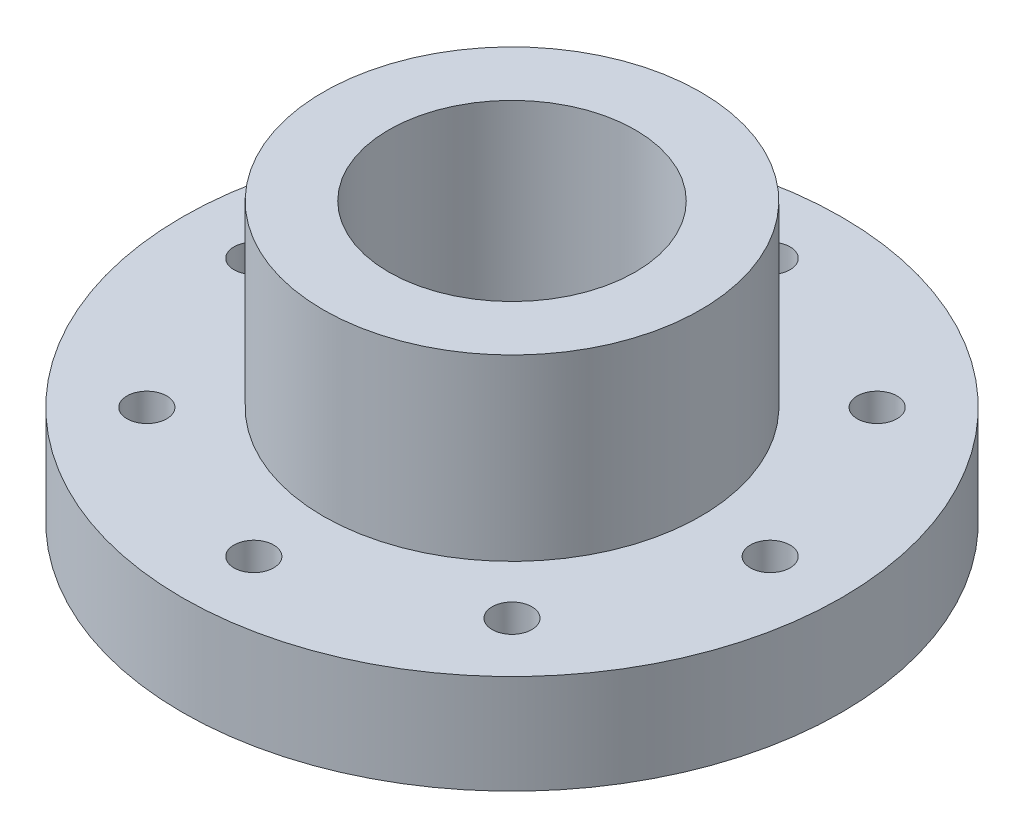
ISO-10303-21;
HEADER;
FILE_DESCRIPTION(('STEP AP214'),'2;1');
FILE_NAME('part.step','',(''),(''),'','','');
FILE_SCHEMA(('AUTOMOTIVE_DESIGN { 1 0 10303 214 1 1 1 1 }'));
ENDSEC;
DATA;
#1=APPLICATION_CONTEXT('core data for automotive mechanical design processes');
#2=APPLICATION_PROTOCOL_DEFINITION('international standard','automotive_design',2000,#1);
#3=PRODUCT_CONTEXT('',#1,'mechanical');
#4=PRODUCT('Part','Part','',(#3));
#5=PRODUCT_RELATED_PRODUCT_CATEGORY('part','',(#4));
#6=PRODUCT_DEFINITION_FORMATION('','',#4);
#7=PRODUCT_DEFINITION_CONTEXT('part definition',#1,'design');
#8=PRODUCT_DEFINITION('design','',#6,#7);
#9=PRODUCT_DEFINITION_SHAPE('','',#8);
#10=(LENGTH_UNIT() NAMED_UNIT(*) SI_UNIT(.MILLI.,.METRE.));
#11=(NAMED_UNIT(*) PLANE_ANGLE_UNIT() SI_UNIT($,.RADIAN.));
#12=(NAMED_UNIT(*) SI_UNIT($,.STERADIAN.) SOLID_ANGLE_UNIT());
#13=UNCERTAINTY_MEASURE_WITH_UNIT(LENGTH_MEASURE(1.E-05),#10,'distance_accuracy_value','');
#14=(GEOMETRIC_REPRESENTATION_CONTEXT(3) GLOBAL_UNCERTAINTY_ASSIGNED_CONTEXT((#13)) GLOBAL_UNIT_ASSIGNED_CONTEXT((#10,
#11,#12)) REPRESENTATION_CONTEXT('',''));
#15=CARTESIAN_POINT('',(0.,0.,0.));
#16=DIRECTION('',(0.,0.,1.));
#17=DIRECTION('',(1.,0.,0.));
#18=AXIS2_PLACEMENT_3D('',#15,#16,#17);
#19=CARTESIAN_POINT('',(0.,37.4192308901425,0.));
#20=DIRECTION('',(0.,1.,0.));
#21=DIRECTION('',(0.,0.,1.));
#22=AXIS2_PLACEMENT_3D('',#19,#20,#21);
#23=CYLINDRICAL_SURFACE('',#22,47.5);
#24=CARTESIAN_POINT('',(0.,22.5,0.));
#25=DIRECTION('',(0.,1.,0.));
#26=DIRECTION('',(0.,0.,1.));
#27=AXIS2_PLACEMENT_3D('',#24,#25,#26);
#28=CIRCLE('',#27,47.5);
#29=CARTESIAN_POINT('',(0.,22.5,47.5));
#30=VERTEX_POINT('',#29);
#31=EDGE_CURVE('E13',#30,#30,#28,.T.);
#32=ORIENTED_EDGE('',*,*,#31,.F.);
#33=EDGE_LOOP('',(#32));
#34=FACE_BOUND('',#33,.T.);
#35=CARTESIAN_POINT('',(0.,25.,0.));
#36=DIRECTION('',(0.,-1.,0.));
#37=DIRECTION('',(0.,0.,-1.));
#38=AXIS2_PLACEMENT_3D('',#35,#36,#37);
#39=CIRCLE('',#38,47.5);
#40=CARTESIAN_POINT('',(0.,25.,-47.5));
#41=VERTEX_POINT('',#40);
#42=EDGE_CURVE('E75',#41,#41,#39,.T.);
#43=ORIENTED_EDGE('',*,*,#42,.F.);
#44=EDGE_LOOP('',(#43));
#45=FACE_BOUND('',#44,.T.);
#46=ADVANCED_FACE('F57',(#34,#45),#23,.F.);
#47=CARTESIAN_POINT('',(47.5,22.5,0.));
#48=DIRECTION('',(0.,1.,0.));
#49=DIRECTION('',(0.,0.,1.));
#50=AXIS2_PLACEMENT_3D('',#47,#48,#49);
#51=PLANE('',#50);
#52=ORIENTED_EDGE('',*,*,#31,.T.);
#53=EDGE_LOOP('',(#52));
#54=FACE_BOUND('',#53,.T.);
#55=CARTESIAN_POINT('',(0.,22.5,0.));
#56=DIRECTION('',(0.,1.,0.));
#57=DIRECTION('',(0.,0.,1.));
#58=AXIS2_PLACEMENT_3D('',#55,#56,#57);
#59=CIRCLE('',#58,31.025);
#60=CARTESIAN_POINT('',(0.,22.5,31.025));
#61=VERTEX_POINT('',#60);
#62=EDGE_CURVE('E61',#61,#61,#59,.T.);
#63=ORIENTED_EDGE('',*,*,#62,.F.);
#64=EDGE_LOOP('',(#63));
#65=FACE_BOUND('',#64,.T.);
#66=ADVANCED_FACE('F141',(#54,#65),#51,.T.);
#67=CARTESIAN_POINT('',(55.1,5.99999999999998,0.));
#68=DIRECTION('',(0.,-1.,0.));
#69=DIRECTION('',(0.,0.,-1.));
#70=AXIS2_PLACEMENT_3D('',#67,#68,#69);
#71=PLANE('',#70);
#72=CARTESIAN_POINT('',(0.,6.00000000000001,0.));
#73=DIRECTION('',(0.,-1.,0.));
#74=DIRECTION('',(0.,0.,-1.));
#75=AXIS2_PLACEMENT_3D('',#72,#73,#74);
#76=CIRCLE('',#75,55.1);
#77=CARTESIAN_POINT('',(0.,6.00000000000001,-55.1));
#78=VERTEX_POINT('',#77);
#79=EDGE_CURVE('E131',#78,#78,#76,.T.);
#80=ORIENTED_EDGE('',*,*,#79,.T.);
#81=EDGE_LOOP('',(#80));
#82=FACE_BOUND('',#81,.T.);
#83=CARTESIAN_POINT('',(0.,6.00000000000001,0.));
#84=DIRECTION('',(0.,-1.,0.));
#85=DIRECTION('',(0.,0.,-1.));
#86=AXIS2_PLACEMENT_3D('',#83,#84,#85);
#87=CIRCLE('',#86,25.5);
#88=CARTESIAN_POINT('',(0.,6.00000000000001,-25.5));
#89=VERTEX_POINT('',#88);
#90=EDGE_CURVE('E90',#89,#89,#87,.T.);
#91=ORIENTED_EDGE('',*,*,#90,.F.);
#92=EDGE_LOOP('',(#91));
#93=FACE_BOUND('',#92,.T.);
#94=ADVANCED_FACE('F139',(#82,#93),#71,.T.);
#95=CARTESIAN_POINT('',(0.,0.,0.));
#96=DIRECTION('',(0.,-1.,0.));
#97=DIRECTION('',(0.,0.,-1.));
#98=AXIS2_PLACEMENT_3D('',#95,#96,#97);
#99=CYLINDRICAL_SURFACE('',#98,25.5);
#100=ORIENTED_EDGE('',*,*,#90,.T.);
#101=EDGE_LOOP('',(#100));
#102=FACE_BOUND('',#101,.T.);
#103=CARTESIAN_POINT('',(0.,20.,0.));
#104=DIRECTION('',(0.,-1.,0.));
#105=DIRECTION('',(0.,0.,-1.));
#106=AXIS2_PLACEMENT_3D('',#103,#104,#105);
#107=CIRCLE('',#106,25.5);
#108=CARTESIAN_POINT('',(0.,20.,-25.5));
#109=VERTEX_POINT('',#108);
#110=EDGE_CURVE('E85',#109,#109,#107,.T.);
#111=ORIENTED_EDGE('',*,*,#110,.F.);
#112=EDGE_LOOP('',(#111));
#113=FACE_BOUND('',#112,.T.);
#114=ADVANCED_FACE('F136',(#102,#113),#99,.F.);
#115=CARTESIAN_POINT('',(25.5,20.,0.));
#116=DIRECTION('',(0.,1.,0.));
#117=DIRECTION('',(0.,0.,1.));
#118=AXIS2_PLACEMENT_3D('',#115,#116,#117);
#119=PLANE('',#118);
#120=ORIENTED_EDGE('',*,*,#110,.T.);
#121=EDGE_LOOP('',(#120));
#122=FACE_BOUND('',#121,.T.);
#123=CARTESIAN_POINT('',(0.,20.,0.));
#124=DIRECTION('',(0.,-1.,0.));
#125=DIRECTION('',(0.,0.,-1.));
#126=AXIS2_PLACEMENT_3D('',#123,#124,#125);
#127=CIRCLE('',#126,31.025);
#128=CARTESIAN_POINT('',(0.,20.,-31.025));
#129=VERTEX_POINT('',#128);
#130=EDGE_CURVE('E78',#129,#129,#127,.T.);
#131=ORIENTED_EDGE('',*,*,#130,.F.);
#132=EDGE_LOOP('',(#131));
#133=FACE_BOUND('',#132,.T.);
#134=ADVANCED_FACE('F148',(#122,#133),#119,.T.);
#135=CARTESIAN_POINT('',(0.,0.,0.));
#136=DIRECTION('',(0.,-1.,0.));
#137=DIRECTION('',(0.,0.,-1.));
#138=AXIS2_PLACEMENT_3D('',#135,#136,#137);
#139=CYLINDRICAL_SURFACE('',#138,31.025);
#140=ORIENTED_EDGE('',*,*,#130,.T.);
#141=EDGE_LOOP('',(#140));
#142=FACE_BOUND('',#141,.T.);
#143=ORIENTED_EDGE('',*,*,#62,.T.);
#144=EDGE_LOOP('',(#143));
#145=FACE_BOUND('',#144,.T.);
#146=ADVANCED_FACE('F59',(#142,#145),#139,.F.);
#147=CARTESIAN_POINT('',(0.,0.,0.));
#148=DIRECTION('',(0.,-1.,0.));
#149=DIRECTION('',(0.,0.,-1.));
#150=AXIS2_PLACEMENT_3D('',#147,#148,#149);
#151=CYLINDRICAL_SURFACE('',#150,55.1);
#152=CARTESIAN_POINT('',(0.,0.,0.));
#153=DIRECTION('',(0.,-1.,0.));
#154=DIRECTION('',(0.,0.,-1.));
#155=AXIS2_PLACEMENT_3D('',#152,#153,#154);
#156=CIRCLE('',#155,55.1);
#157=CARTESIAN_POINT('',(0.,0.,-55.1));
#158=VERTEX_POINT('',#157);
#159=EDGE_CURVE('E128',#158,#158,#156,.T.);
#160=ORIENTED_EDGE('',*,*,#159,.T.);
#161=EDGE_LOOP('',(#160));
#162=FACE_BOUND('',#161,.T.);
#163=ORIENTED_EDGE('',*,*,#79,.F.);
#164=EDGE_LOOP('',(#163));
#165=FACE_BOUND('',#164,.T.);
#166=ADVANCED_FACE('F152',(#162,#165),#151,.F.);
#167=CARTESIAN_POINT('',(83.,0.,0.));
#168=DIRECTION('',(0.,-1.,0.));
#169=DIRECTION('',(0.,0.,-1.));
#170=AXIS2_PLACEMENT_3D('',#167,#168,#169);
#171=PLANE('',#170);
#172=CARTESIAN_POINT('',(65.,0.,0.));
#173=DIRECTION('',(0.,-1.,0.));
#174=DIRECTION('',(0.,0.,-1.));
#175=AXIS2_PLACEMENT_3D('',#172,#173,#174);
#176=CIRCLE('',#175,5.);
#177=CARTESIAN_POINT('',(65.,0.,-5.00000000000003));
#178=VERTEX_POINT('',#177);
#179=EDGE_CURVE('E73',#178,#178,#176,.T.);
#180=ORIENTED_EDGE('',*,*,#179,.F.);
#181=EDGE_LOOP('',(#180));
#182=FACE_BOUND('',#181,.T.);
#183=CARTESIAN_POINT('',(45.9619407771255,0.,-45.9619407771256));
#184=DIRECTION('',(0.,-1.,0.));
#185=DIRECTION('',(0.,0.,-1.));
#186=AXIS2_PLACEMENT_3D('',#183,#184,#185);
#187=CIRCLE('',#186,5.00000000000078);
#188=CARTESIAN_POINT('',(45.9619407771255,0.,-50.9619407771264));
#189=VERTEX_POINT('',#188);
#190=EDGE_CURVE('E107',#189,#189,#187,.T.);
#191=ORIENTED_EDGE('',*,*,#190,.F.);
#192=EDGE_LOOP('',(#191));
#193=FACE_BOUND('',#192,.T.);
#194=CARTESIAN_POINT('',(-2.4980018054066E-13,0.,-65.));
#195=DIRECTION('',(0.,-1.,0.));
#196=DIRECTION('',(0.,0.,-1.));
#197=AXIS2_PLACEMENT_3D('',#194,#195,#196);
#198=CIRCLE('',#197,5.00000000000089);
#199=CARTESIAN_POINT('',(-2.4980018054066E-13,0.,-70.0000000000009));
#200=VERTEX_POINT('',#199);
#201=EDGE_CURVE('E105',#200,#200,#198,.T.);
#202=ORIENTED_EDGE('',*,*,#201,.F.);
#203=EDGE_LOOP('',(#202));
#204=FACE_BOUND('',#203,.T.);
#205=CARTESIAN_POINT('',(-45.9619407771258,0.,-45.9619407771253));
#206=DIRECTION('',(0.,-1.,0.));
#207=DIRECTION('',(0.,0.,-1.));
#208=AXIS2_PLACEMENT_3D('',#205,#206,#207);
#209=CIRCLE('',#208,5.00000000000043);
#210=CARTESIAN_POINT('',(-45.9619407771258,0.,-50.9619407771257));
#211=VERTEX_POINT('',#210);
#212=EDGE_CURVE('E102',#211,#211,#209,.T.);
#213=ORIENTED_EDGE('',*,*,#212,.F.);
#214=EDGE_LOOP('',(#213));
#215=FACE_BOUND('',#214,.T.);
#216=CARTESIAN_POINT('',(-65.,0.,0.));
#217=DIRECTION('',(0.,-1.,0.));
#218=DIRECTION('',(0.,0.,-1.));
#219=AXIS2_PLACEMENT_3D('',#216,#217,#218);
#220=CIRCLE('',#219,5.);
#221=CARTESIAN_POINT('',(-65.,0.,-5.));
#222=VERTEX_POINT('',#221);
#223=EDGE_CURVE('E99',#222,#222,#220,.T.);
#224=ORIENTED_EDGE('',*,*,#223,.F.);
#225=EDGE_LOOP('',(#224));
#226=FACE_BOUND('',#225,.T.);
#227=CARTESIAN_POINT('',(-45.9619407771252,0.,45.961940777126));
#228=DIRECTION('',(0.,-1.,0.));
#229=DIRECTION('',(0.,0.,-1.));
#230=AXIS2_PLACEMENT_3D('',#227,#228,#229);
#231=CIRCLE('',#230,4.99999999999997);
#232=CARTESIAN_POINT('',(-45.9619407771252,0.,40.961940777126));
#233=VERTEX_POINT('',#232);
#234=EDGE_CURVE('E96',#233,#233,#231,.T.);
#235=ORIENTED_EDGE('',*,*,#234,.F.);
#236=EDGE_LOOP('',(#235));
#237=FACE_BOUND('',#236,.T.);
#238=CARTESIAN_POINT('',(7.21644966006352E-13,0.,65.));
#239=DIRECTION('',(0.,-1.,0.));
#240=DIRECTION('',(0.,0.,-1.));
#241=AXIS2_PLACEMENT_3D('',#238,#239,#240);
#242=CIRCLE('',#241,5.00000000000001);
#243=CARTESIAN_POINT('',(7.21644966006352E-13,0.,60.));
#244=VERTEX_POINT('',#243);
#245=EDGE_CURVE('E70',#244,#244,#242,.T.);
#246=ORIENTED_EDGE('',*,*,#245,.F.);
#247=EDGE_LOOP('',(#246));
#248=FACE_BOUND('',#247,.T.);
#249=CARTESIAN_POINT('',(45.9619407771261,0.,45.961940777125));
#250=DIRECTION('',(0.,-1.,0.));
#251=DIRECTION('',(0.,0.,-1.));
#252=AXIS2_PLACEMENT_3D('',#249,#250,#251);
#253=CIRCLE('',#252,5.00000000000001);
#254=CARTESIAN_POINT('',(45.9619407771261,0.,40.961940777125));
#255=VERTEX_POINT('',#254);
#256=EDGE_CURVE('E65',#255,#255,#253,.T.);
#257=ORIENTED_EDGE('',*,*,#256,.F.);
#258=EDGE_LOOP('',(#257));
#259=FACE_BOUND('',#258,.T.);
#260=CARTESIAN_POINT('',(0.,0.,0.));
#261=DIRECTION('',(0.,-1.,0.));
#262=DIRECTION('',(0.,0.,-1.));
#263=AXIS2_PLACEMENT_3D('',#260,#261,#262);
#264=CIRCLE('',#263,83.);
#265=CARTESIAN_POINT('',(0.,0.,-83.));
#266=VERTEX_POINT('',#265);
#267=EDGE_CURVE('E125',#266,#266,#264,.T.);
#268=ORIENTED_EDGE('',*,*,#267,.T.);
#269=EDGE_LOOP('',(#268));
#270=FACE_BOUND('',#269,.T.);
#271=ORIENTED_EDGE('',*,*,#159,.F.);
#272=EDGE_LOOP('',(#271));
#273=FACE_BOUND('',#272,.T.);
#274=ADVANCED_FACE('F247',(#182,#193,#204,#215,#226,#237,#248,#259,#270,#273),#171,.T.);
#275=CARTESIAN_POINT('',(0.,0.,0.));
#276=DIRECTION('',(0.,-1.,0.));
#277=DIRECTION('',(0.,0.,-1.));
#278=AXIS2_PLACEMENT_3D('',#275,#276,#277);
#279=CYLINDRICAL_SURFACE('',#278,83.);
#280=CARTESIAN_POINT('',(0.,25.,0.));
#281=DIRECTION('',(0.,-1.,0.));
#282=DIRECTION('',(0.,0.,-1.));
#283=AXIS2_PLACEMENT_3D('',#280,#281,#282);
#284=CIRCLE('',#283,83.);
#285=CARTESIAN_POINT('',(0.,25.,-83.));
#286=VERTEX_POINT('',#285);
#287=EDGE_CURVE('E77',#286,#286,#284,.T.);
#288=ORIENTED_EDGE('',*,*,#287,.T.);
#289=EDGE_LOOP('',(#288));
#290=FACE_BOUND('',#289,.T.);
#291=ORIENTED_EDGE('',*,*,#267,.F.);
#292=EDGE_LOOP('',(#291));
#293=FACE_BOUND('',#292,.T.);
#294=ADVANCED_FACE('F166',(#290,#293),#279,.T.);
#295=CARTESIAN_POINT('',(45.9619407771261,70.,45.961940777125));
#296=DIRECTION('',(0.,-1.,0.));
#297=DIRECTION('',(0.,0.,-1.));
#298=AXIS2_PLACEMENT_3D('',#295,#296,#297);
#299=CYLINDRICAL_SURFACE('',#298,5.00000000000001);
#300=CARTESIAN_POINT('',(45.9619407771261,25.,45.961940777125));
#301=DIRECTION('',(0.,1.,0.));
#302=DIRECTION('',(0.,0.,1.));
#303=AXIS2_PLACEMENT_3D('',#300,#301,#302);
#304=CIRCLE('',#303,5.00000000000001);
#305=CARTESIAN_POINT('',(45.9619407771261,25.,50.961940777125));
#306=VERTEX_POINT('',#305);
#307=EDGE_CURVE('E112',#306,#306,#304,.T.);
#308=ORIENTED_EDGE('',*,*,#307,.T.);
#309=EDGE_LOOP('',(#308));
#310=FACE_BOUND('',#309,.T.);
#311=ORIENTED_EDGE('',*,*,#256,.T.);
#312=EDGE_LOOP('',(#311));
#313=FACE_BOUND('',#312,.T.);
#314=ADVANCED_FACE('F162',(#310,#313),#299,.F.);
#315=CARTESIAN_POINT('',(7.21644966006352E-13,70.,65.));
#316=DIRECTION('',(0.,-1.,0.));
#317=DIRECTION('',(0.,0.,-1.));
#318=AXIS2_PLACEMENT_3D('',#315,#316,#317);
#319=CYLINDRICAL_SURFACE('',#318,5.00000000000001);
#320=CARTESIAN_POINT('',(7.21644966006352E-13,25.,65.));
#321=DIRECTION('',(0.,1.,0.));
#322=DIRECTION('',(0.,0.,1.));
#323=AXIS2_PLACEMENT_3D('',#320,#321,#322);
#324=CIRCLE('',#323,5.00000000000001);
#325=CARTESIAN_POINT('',(7.21644966006352E-13,25.,70.));
#326=VERTEX_POINT('',#325);
#327=EDGE_CURVE('E116',#326,#326,#324,.T.);
#328=ORIENTED_EDGE('',*,*,#327,.T.);
#329=EDGE_LOOP('',(#328));
#330=FACE_BOUND('',#329,.T.);
#331=ORIENTED_EDGE('',*,*,#245,.T.);
#332=EDGE_LOOP('',(#331));
#333=FACE_BOUND('',#332,.T.);
#334=ADVANCED_FACE('F165',(#330,#333),#319,.F.);
#335=CARTESIAN_POINT('',(-45.9619407771252,70.,45.961940777126));
#336=DIRECTION('',(0.,-1.,0.));
#337=DIRECTION('',(0.,0.,-1.));
#338=AXIS2_PLACEMENT_3D('',#335,#336,#337);
#339=CYLINDRICAL_SURFACE('',#338,4.99999999999997);
#340=CARTESIAN_POINT('',(-45.9619407771252,25.,45.961940777126));
#341=DIRECTION('',(0.,1.,0.));
#342=DIRECTION('',(0.,0.,1.));
#343=AXIS2_PLACEMENT_3D('',#340,#341,#342);
#344=CIRCLE('',#343,4.99999999999997);
#345=CARTESIAN_POINT('',(-45.9619407771252,25.,50.961940777126));
#346=VERTEX_POINT('',#345);
#347=EDGE_CURVE('E121',#346,#346,#344,.T.);
#348=ORIENTED_EDGE('',*,*,#347,.T.);
#349=EDGE_LOOP('',(#348));
#350=FACE_BOUND('',#349,.T.);
#351=ORIENTED_EDGE('',*,*,#234,.T.);
#352=EDGE_LOOP('',(#351));
#353=FACE_BOUND('',#352,.T.);
#354=ADVANCED_FACE('F169',(#350,#353),#339,.F.);
#355=CARTESIAN_POINT('',(-65.,70.,0.));
#356=DIRECTION('',(0.,-1.,0.));
#357=DIRECTION('',(0.,0.,-1.));
#358=AXIS2_PLACEMENT_3D('',#355,#356,#357);
#359=CYLINDRICAL_SURFACE('',#358,5.);
#360=CARTESIAN_POINT('',(-65.,25.,0.));
#361=DIRECTION('',(0.,1.,0.));
#362=DIRECTION('',(0.,0.,1.));
#363=AXIS2_PLACEMENT_3D('',#360,#361,#362);
#364=CIRCLE('',#363,5.);
#365=CARTESIAN_POINT('',(-65.,25.,5.));
#366=VERTEX_POINT('',#365);
#367=EDGE_CURVE('E327',#366,#366,#364,.T.);
#368=ORIENTED_EDGE('',*,*,#367,.T.);
#369=EDGE_LOOP('',(#368));
#370=FACE_BOUND('',#369,.T.);
#371=ORIENTED_EDGE('',*,*,#223,.T.);
#372=EDGE_LOOP('',(#371));
#373=FACE_BOUND('',#372,.T.);
#374=ADVANCED_FACE('F173',(#370,#373),#359,.F.);
#375=CARTESIAN_POINT('',(-45.9619407771258,70.,-45.9619407771253));
#376=DIRECTION('',(0.,-1.,0.));
#377=DIRECTION('',(0.,0.,-1.));
#378=AXIS2_PLACEMENT_3D('',#375,#376,#377);
#379=CYLINDRICAL_SURFACE('',#378,5.00000000000043);
#380=CARTESIAN_POINT('',(-45.9619407771258,25.,-45.9619407771253));
#381=DIRECTION('',(0.,1.,0.));
#382=DIRECTION('',(0.,0.,1.));
#383=AXIS2_PLACEMENT_3D('',#380,#381,#382);
#384=CIRCLE('',#383,5.00000000000043);
#385=CARTESIAN_POINT('',(-45.9619407771258,25.,-40.9619407771249));
#386=VERTEX_POINT('',#385);
#387=EDGE_CURVE('E324',#386,#386,#384,.T.);
#388=ORIENTED_EDGE('',*,*,#387,.T.);
#389=EDGE_LOOP('',(#388));
#390=FACE_BOUND('',#389,.T.);
#391=ORIENTED_EDGE('',*,*,#212,.T.);
#392=EDGE_LOOP('',(#391));
#393=FACE_BOUND('',#392,.T.);
#394=ADVANCED_FACE('F177',(#390,#393),#379,.F.);
#395=CARTESIAN_POINT('',(-2.22044604925031E-13,70.,-65.));
#396=DIRECTION('',(0.,-1.,0.));
#397=DIRECTION('',(0.,0.,-1.));
#398=AXIS2_PLACEMENT_3D('',#395,#396,#397);
#399=CYLINDRICAL_SURFACE('',#398,5.00000000000089);
#400=CARTESIAN_POINT('',(-2.4980018054066E-13,25.,-65.));
#401=DIRECTION('',(0.,1.,0.));
#402=DIRECTION('',(0.,0.,1.));
#403=AXIS2_PLACEMENT_3D('',#400,#401,#402);
#404=CIRCLE('',#403,5.00000000000089);
#405=CARTESIAN_POINT('',(-2.4980018054066E-13,25.,-59.9999999999991));
#406=VERTEX_POINT('',#405);
#407=EDGE_CURVE('E319',#406,#406,#404,.T.);
#408=ORIENTED_EDGE('',*,*,#407,.T.);
#409=EDGE_LOOP('',(#408));
#410=FACE_BOUND('',#409,.T.);
#411=ORIENTED_EDGE('',*,*,#201,.T.);
#412=EDGE_LOOP('',(#411));
#413=FACE_BOUND('',#412,.T.);
#414=ADVANCED_FACE('F181',(#410,#413),#399,.F.);
#415=CARTESIAN_POINT('',(45.9619407771255,70.,-45.9619407771256));
#416=DIRECTION('',(0.,-1.,0.));
#417=DIRECTION('',(0.,0.,-1.));
#418=AXIS2_PLACEMENT_3D('',#415,#416,#417);
#419=CYLINDRICAL_SURFACE('',#418,5.00000000000078);
#420=CARTESIAN_POINT('',(45.9619407771255,25.,-45.9619407771256));
#421=DIRECTION('',(0.,1.,0.));
#422=DIRECTION('',(0.,0.,1.));
#423=AXIS2_PLACEMENT_3D('',#420,#421,#422);
#424=CIRCLE('',#423,5.00000000000078);
#425=CARTESIAN_POINT('',(45.9619407771255,25.,-40.9619407771249));
#426=VERTEX_POINT('',#425);
#427=EDGE_CURVE('E316',#426,#426,#424,.T.);
#428=ORIENTED_EDGE('',*,*,#427,.T.);
#429=EDGE_LOOP('',(#428));
#430=FACE_BOUND('',#429,.T.);
#431=ORIENTED_EDGE('',*,*,#190,.T.);
#432=EDGE_LOOP('',(#431));
#433=FACE_BOUND('',#432,.T.);
#434=ADVANCED_FACE('F185',(#430,#433),#419,.F.);
#435=CARTESIAN_POINT('',(65.,70.,0.));
#436=DIRECTION('',(0.,-1.,0.));
#437=DIRECTION('',(0.,0.,-1.));
#438=AXIS2_PLACEMENT_3D('',#435,#436,#437);
#439=CYLINDRICAL_SURFACE('',#438,5.);
#440=CARTESIAN_POINT('',(65.,25.,0.));
#441=DIRECTION('',(0.,1.,0.));
#442=DIRECTION('',(0.,0.,1.));
#443=AXIS2_PLACEMENT_3D('',#440,#441,#442);
#444=CIRCLE('',#443,5.);
#445=CARTESIAN_POINT('',(65.,25.,4.99999999999998));
#446=VERTEX_POINT('',#445);
#447=EDGE_CURVE('E82',#446,#446,#444,.T.);
#448=ORIENTED_EDGE('',*,*,#447,.T.);
#449=EDGE_LOOP('',(#448));
#450=FACE_BOUND('',#449,.T.);
#451=ORIENTED_EDGE('',*,*,#179,.T.);
#452=EDGE_LOOP('',(#451));
#453=FACE_BOUND('',#452,.T.);
#454=ADVANCED_FACE('F160',(#450,#453),#439,.F.);
#455=CARTESIAN_POINT('',(83.,25.,0.));
#456=DIRECTION('',(0.,1.,0.));
#457=DIRECTION('',(0.,0.,1.));
#458=AXIS2_PLACEMENT_3D('',#455,#456,#457);
#459=PLANE('',#458);
#460=ORIENTED_EDGE('',*,*,#447,.F.);
#461=EDGE_LOOP('',(#460));
#462=FACE_BOUND('',#461,.T.);
#463=ORIENTED_EDGE('',*,*,#427,.F.);
#464=EDGE_LOOP('',(#463));
#465=FACE_BOUND('',#464,.T.);
#466=ORIENTED_EDGE('',*,*,#407,.F.);
#467=EDGE_LOOP('',(#466));
#468=FACE_BOUND('',#467,.T.);
#469=ORIENTED_EDGE('',*,*,#387,.F.);
#470=EDGE_LOOP('',(#469));
#471=FACE_BOUND('',#470,.T.);
#472=ORIENTED_EDGE('',*,*,#367,.F.);
#473=EDGE_LOOP('',(#472));
#474=FACE_BOUND('',#473,.T.);
#475=ORIENTED_EDGE('',*,*,#347,.F.);
#476=EDGE_LOOP('',(#475));
#477=FACE_BOUND('',#476,.T.);
#478=ORIENTED_EDGE('',*,*,#327,.F.);
#479=EDGE_LOOP('',(#478));
#480=FACE_BOUND('',#479,.T.);
#481=ORIENTED_EDGE('',*,*,#307,.F.);
#482=EDGE_LOOP('',(#481));
#483=FACE_BOUND('',#482,.T.);
#484=ORIENTED_EDGE('',*,*,#42,.T.);
#485=EDGE_LOOP('',(#484));
#486=FACE_BOUND('',#485,.T.);
#487=ORIENTED_EDGE('',*,*,#287,.F.);
#488=EDGE_LOOP('',(#487));
#489=FACE_BOUND('',#488,.T.);
#490=ADVANCED_FACE('F150',(#462,#465,#468,#471,#474,#477,#480,#483,#486,#489),#459,.T.);
#491=CLOSED_SHELL('',(#46,#66,#94,#114,#134,#146,#166,#274,#294,#314,#334,#354,#374,#394,#414,
#434,#454,#490));
#492=MANIFOLD_SOLID_BREP('B2',#491);
#493=CARTESIAN_POINT('',(47.5,22.5,0.));
#494=DIRECTION('',(0.,1.,0.));
#495=DIRECTION('',(0.,0.,1.));
#496=AXIS2_PLACEMENT_3D('',#493,#494,#495);
#497=PLANE('',#496);
#498=CARTESIAN_POINT('',(0.,22.5,0.));
#499=DIRECTION('',(0.,1.,0.));
#500=DIRECTION('',(0.,0.,1.));
#501=AXIS2_PLACEMENT_3D('',#498,#499,#500);
#502=CIRCLE('',#501,31.025);
#503=CARTESIAN_POINT('',(0.,22.5,31.025));
#504=VERTEX_POINT('',#503);
#505=EDGE_CURVE('E361',#504,#504,#502,.T.);
#506=ORIENTED_EDGE('',*,*,#505,.T.);
#507=EDGE_LOOP('',(#506));
#508=FACE_BOUND('',#507,.T.);
#509=CARTESIAN_POINT('',(0.,22.5,0.));
#510=DIRECTION('',(0.,1.,0.));
#511=DIRECTION('',(0.,0.,1.));
#512=AXIS2_PLACEMENT_3D('',#509,#510,#511);
#513=CIRCLE('',#512,47.5);
#514=CARTESIAN_POINT('',(0.,22.5,47.5));
#515=VERTEX_POINT('',#514);
#516=EDGE_CURVE('E56',#515,#515,#513,.T.);
#517=ORIENTED_EDGE('',*,*,#516,.F.);
#518=EDGE_LOOP('',(#517));
#519=FACE_BOUND('',#518,.T.);
#520=ADVANCED_FACE('F355',(#508,#519),#497,.F.);
#521=CARTESIAN_POINT('',(0.,0.,0.));
#522=DIRECTION('',(0.,-1.,0.));
#523=DIRECTION('',(0.,0.,-1.));
#524=AXIS2_PLACEMENT_3D('',#521,#522,#523);
#525=CYLINDRICAL_SURFACE('',#524,31.025);
#526=ORIENTED_EDGE('',*,*,#505,.F.);
#527=EDGE_LOOP('',(#526));
#528=FACE_BOUND('',#527,.T.);
#529=CARTESIAN_POINT('',(0.,70.,0.));
#530=DIRECTION('',(0.,-1.,0.));
#531=DIRECTION('',(0.,0.,-1.));
#532=AXIS2_PLACEMENT_3D('',#529,#530,#531);
#533=CIRCLE('',#532,31.025);
#534=CARTESIAN_POINT('',(0.,70.,-31.025));
#535=VERTEX_POINT('',#534);
#536=EDGE_CURVE('E365',#535,#535,#533,.T.);
#537=ORIENTED_EDGE('',*,*,#536,.F.);
#538=EDGE_LOOP('',(#537));
#539=FACE_BOUND('',#538,.T.);
#540=ADVANCED_FACE('F379',(#528,#539),#525,.F.);
#541=CARTESIAN_POINT('',(32.5,70.,0.));
#542=DIRECTION('',(0.,1.,0.));
#543=DIRECTION('',(0.,0.,1.));
#544=AXIS2_PLACEMENT_3D('',#541,#542,#543);
#545=PLANE('',#544);
#546=ORIENTED_EDGE('',*,*,#536,.T.);
#547=EDGE_LOOP('',(#546));
#548=FACE_BOUND('',#547,.T.);
#549=CARTESIAN_POINT('',(0.,70.,0.));
#550=DIRECTION('',(0.,-1.,0.));
#551=DIRECTION('',(0.,0.,-1.));
#552=AXIS2_PLACEMENT_3D('',#549,#550,#551);
#553=CIRCLE('',#552,47.5);
#554=CARTESIAN_POINT('',(0.,70.,-47.5));
#555=VERTEX_POINT('',#554);
#556=EDGE_CURVE('E369',#555,#555,#553,.T.);
#557=ORIENTED_EDGE('',*,*,#556,.F.);
#558=EDGE_LOOP('',(#557));
#559=FACE_BOUND('',#558,.T.);
#560=ADVANCED_FACE('F377',(#548,#559),#545,.T.);
#561=CARTESIAN_POINT('',(0.,0.,0.));
#562=DIRECTION('',(0.,-1.,0.));
#563=DIRECTION('',(0.,0.,-1.));
#564=AXIS2_PLACEMENT_3D('',#561,#562,#563);
#565=CYLINDRICAL_SURFACE('',#564,47.5);
#566=ORIENTED_EDGE('',*,*,#556,.T.);
#567=EDGE_LOOP('',(#566));
#568=FACE_BOUND('',#567,.T.);
#569=ORIENTED_EDGE('',*,*,#516,.T.);
#570=EDGE_LOOP('',(#569));
#571=FACE_BOUND('',#570,.T.);
#572=ADVANCED_FACE('F375',(#568,#571),#565,.T.);
#573=CLOSED_SHELL('',(#520,#540,#560,#572));
#574=MANIFOLD_SOLID_BREP('B8_NOT_SHOWN',#573);
#575=ADVANCED_BREP_SHAPE_REPRESENTATION('',(#18,#492,#574),#14);
#576=SHAPE_DEFINITION_REPRESENTATION(#9,#575);
ENDSEC;
END-ISO-10303-21;
